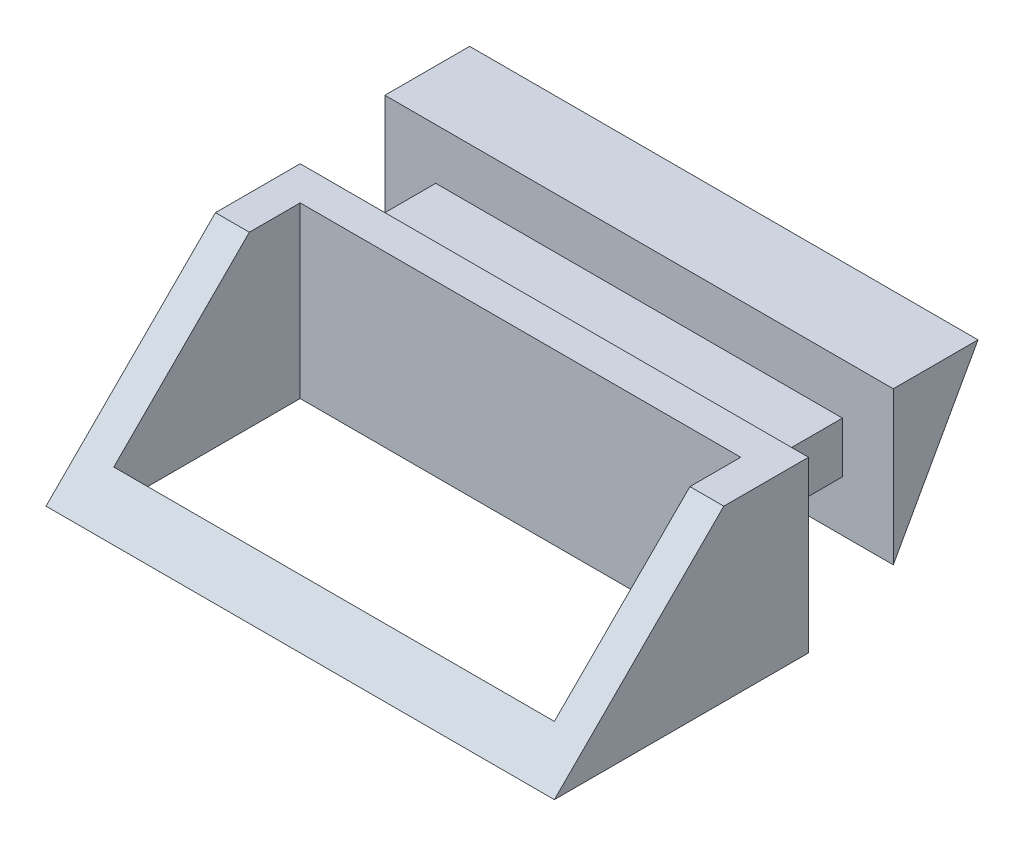
ISO-10303-21;
HEADER;
FILE_DESCRIPTION(('STEP AP214'),'2;1');
FILE_NAME('part.step','',(''),(''),'','','');
FILE_SCHEMA(('AUTOMOTIVE_DESIGN { 1 0 10303 214 1 1 1 1 }'));
ENDSEC;
DATA;
#1=APPLICATION_CONTEXT('core data for automotive mechanical design processes');
#2=APPLICATION_PROTOCOL_DEFINITION('international standard','automotive_design',2000,#1);
#3=PRODUCT_CONTEXT('',#1,'mechanical');
#4=PRODUCT('Part','Part','',(#3));
#5=PRODUCT_RELATED_PRODUCT_CATEGORY('part','',(#4));
#6=PRODUCT_DEFINITION_FORMATION('','',#4);
#7=PRODUCT_DEFINITION_CONTEXT('part definition',#1,'design');
#8=PRODUCT_DEFINITION('design','',#6,#7);
#9=PRODUCT_DEFINITION_SHAPE('','',#8);
#10=(LENGTH_UNIT() NAMED_UNIT(*) SI_UNIT(.MILLI.,.METRE.));
#11=(NAMED_UNIT(*) PLANE_ANGLE_UNIT() SI_UNIT($,.RADIAN.));
#12=(NAMED_UNIT(*) SI_UNIT($,.STERADIAN.) SOLID_ANGLE_UNIT());
#13=UNCERTAINTY_MEASURE_WITH_UNIT(LENGTH_MEASURE(1.E-05),#10,'distance_accuracy_value','');
#14=(GEOMETRIC_REPRESENTATION_CONTEXT(3) GLOBAL_UNCERTAINTY_ASSIGNED_CONTEXT((#13)) GLOBAL_UNIT_ASSIGNED_CONTEXT((#10,
#11,#12)) REPRESENTATION_CONTEXT('',''));
#15=CARTESIAN_POINT('',(0.,0.,0.));
#16=DIRECTION('',(0.,0.,1.));
#17=DIRECTION('',(1.,0.,0.));
#18=AXIS2_PLACEMENT_3D('',#15,#16,#17);
#19=CARTESIAN_POINT('',(-15.,10.,-7.5));
#20=DIRECTION('',(0.,0.,1.));
#21=DIRECTION('',(1.,0.,0.));
#22=AXIS2_PLACEMENT_3D('',#19,#20,#21);
#23=PLANE('',#22);
#24=DIRECTION('',(-1.,0.,0.));
#25=VECTOR('',#24,1.);
#26=CARTESIAN_POINT('',(-15.,0.,-7.5));
#27=LINE('',#26,#25);
#28=CARTESIAN_POINT('',(15.,0.,-7.5));
#29=VERTEX_POINT('',#28);
#30=CARTESIAN_POINT('',(-15.,0.,-7.5));
#31=VERTEX_POINT('',#30);
#32=EDGE_CURVE('E288',#29,#31,#27,.T.);
#33=ORIENTED_EDGE('',*,*,#32,.T.);
#34=DIRECTION('',(0.,-1.,0.));
#35=VECTOR('',#34,1.);
#36=CARTESIAN_POINT('',(-15.,10.,-7.5));
#37=LINE('',#36,#35);
#38=CARTESIAN_POINT('',(-15.,10.,-7.5));
#39=VERTEX_POINT('',#38);
#40=EDGE_CURVE('E284',#39,#31,#37,.T.);
#41=ORIENTED_EDGE('',*,*,#40,.F.);
#42=DIRECTION('',(-1.,0.,0.));
#43=VECTOR('',#42,1.);
#44=CARTESIAN_POINT('',(-15.,10.,-7.5));
#45=LINE('',#44,#43);
#46=CARTESIAN_POINT('',(15.,10.,-7.5));
#47=VERTEX_POINT('',#46);
#48=EDGE_CURVE('E276',#47,#39,#45,.T.);
#49=ORIENTED_EDGE('',*,*,#48,.F.);
#50=DIRECTION('',(0.,-1.,0.));
#51=VECTOR('',#50,1.);
#52=CARTESIAN_POINT('',(15.,10.,-7.5));
#53=LINE('',#52,#51);
#54=EDGE_CURVE('E300',#47,#29,#53,.T.);
#55=ORIENTED_EDGE('',*,*,#54,.T.);
#56=EDGE_LOOP('',(#33,#41,#49,#55));
#57=FACE_BOUND('',#56,.T.);
#58=DIRECTION('',(0.,-1.,0.));
#59=VECTOR('',#58,1.);
#60=CARTESIAN_POINT('',(12.,5.,-7.5));
#61=LINE('',#60,#59);
#62=CARTESIAN_POINT('',(12.,8.,-7.5));
#63=VERTEX_POINT('',#62);
#64=CARTESIAN_POINT('',(12.,5.,-7.5));
#65=VERTEX_POINT('',#64);
#66=EDGE_CURVE('E224',#63,#65,#61,.T.);
#67=ORIENTED_EDGE('',*,*,#66,.F.);
#68=DIRECTION('',(1.,0.,0.));
#69=VECTOR('',#68,1.);
#70=CARTESIAN_POINT('',(12.,8.,-7.5));
#71=LINE('',#70,#69);
#72=CARTESIAN_POINT('',(-12.,8.,-7.5));
#73=VERTEX_POINT('',#72);
#74=EDGE_CURVE('E230',#73,#63,#71,.T.);
#75=ORIENTED_EDGE('',*,*,#74,.F.);
#76=DIRECTION('',(0.,1.,0.));
#77=VECTOR('',#76,1.);
#78=CARTESIAN_POINT('',(-12.,5.,-7.5));
#79=LINE('',#78,#77);
#80=CARTESIAN_POINT('',(-12.,5.,-7.5));
#81=VERTEX_POINT('',#80);
#82=EDGE_CURVE('E250',#81,#73,#79,.T.);
#83=ORIENTED_EDGE('',*,*,#82,.F.);
#84=DIRECTION('',(-1.,0.,0.));
#85=VECTOR('',#84,1.);
#86=CARTESIAN_POINT('',(12.,5.,-7.5));
#87=LINE('',#86,#85);
#88=EDGE_CURVE('E246',#65,#81,#87,.T.);
#89=ORIENTED_EDGE('',*,*,#88,.F.);
#90=EDGE_LOOP('',(#67,#75,#83,#89));
#91=FACE_BOUND('',#90,.T.);
#92=ADVANCED_FACE('F40',(#57,#91),#23,.F.);
#93=CARTESIAN_POINT('',(15.,10.,7.5));
#94=DIRECTION('',(-1.,0.,0.));
#95=DIRECTION('',(0.,0.,1.));
#96=AXIS2_PLACEMENT_3D('',#93,#94,#95);
#97=PLANE('',#96);
#98=DIRECTION('',(0.,0.,-1.));
#99=VECTOR('',#98,1.);
#100=CARTESIAN_POINT('',(15.,10.,7.5));
#101=LINE('',#100,#99);
#102=CARTESIAN_POINT('',(15.,10.,-2.50000000000001));
#103=VERTEX_POINT('',#102);
#104=EDGE_CURVE('E273',#103,#47,#101,.T.);
#105=ORIENTED_EDGE('',*,*,#104,.F.);
#106=DIRECTION('',(0.,0.707106781186549,-0.707106781186546));
#107=VECTOR('',#106,1.);
#108=CARTESIAN_POINT('',(15.,10.,-2.50000000000001));
#109=LINE('',#108,#107);
#110=CARTESIAN_POINT('',(15.,0.,7.5));
#111=VERTEX_POINT('',#110);
#112=EDGE_CURVE('E309',#103,#111,#109,.F.);
#113=ORIENTED_EDGE('',*,*,#112,.T.);
#114=DIRECTION('',(0.,0.,-1.));
#115=VECTOR('',#114,1.);
#116=CARTESIAN_POINT('',(15.,0.,7.5));
#117=LINE('',#116,#115);
#118=EDGE_CURVE('E272',#111,#29,#117,.T.);
#119=ORIENTED_EDGE('',*,*,#118,.T.);
#120=ORIENTED_EDGE('',*,*,#54,.F.);
#121=EDGE_LOOP('',(#105,#113,#119,#120));
#122=FACE_BOUND('',#121,.T.);
#123=ADVANCED_FACE('F351',(#122),#97,.F.);
#124=CARTESIAN_POINT('',(-15.,10.,7.5));
#125=DIRECTION('',(1.,0.,0.));
#126=DIRECTION('',(0.,0.,-1.));
#127=AXIS2_PLACEMENT_3D('',#124,#125,#126);
#128=PLANE('',#127);
#129=DIRECTION('',(0.,0.,1.));
#130=VECTOR('',#129,1.);
#131=CARTESIAN_POINT('',(-15.,0.,7.5));
#132=LINE('',#131,#130);
#133=CARTESIAN_POINT('',(-15.,0.,7.5));
#134=VERTEX_POINT('',#133);
#135=EDGE_CURVE('E291',#31,#134,#132,.T.);
#136=ORIENTED_EDGE('',*,*,#135,.T.);
#137=DIRECTION('',(0.,-0.707106781186549,0.707106781186546));
#138=VECTOR('',#137,1.);
#139=CARTESIAN_POINT('',(-15.,10.,-2.50000000000001));
#140=LINE('',#139,#138);
#141=CARTESIAN_POINT('',(-15.,10.,-2.50000000000001));
#142=VERTEX_POINT('',#141);
#143=EDGE_CURVE('E312',#134,#142,#140,.F.);
#144=ORIENTED_EDGE('',*,*,#143,.T.);
#145=DIRECTION('',(0.,0.,1.));
#146=VECTOR('',#145,1.);
#147=CARTESIAN_POINT('',(-15.,10.,7.5));
#148=LINE('',#147,#146);
#149=EDGE_CURVE('E280',#39,#142,#148,.T.);
#150=ORIENTED_EDGE('',*,*,#149,.F.);
#151=ORIENTED_EDGE('',*,*,#40,.T.);
#152=EDGE_LOOP('',(#136,#144,#150,#151));
#153=FACE_BOUND('',#152,.T.);
#154=ADVANCED_FACE('F357',(#153),#128,.F.);
#155=CARTESIAN_POINT('',(0.,10.,0.));
#156=DIRECTION('',(0.,-1.,0.));
#157=DIRECTION('',(0.,0.,-1.));
#158=AXIS2_PLACEMENT_3D('',#155,#156,#157);
#159=PLANE('',#158);
#160=DIRECTION('',(1.,0.,0.));
#161=VECTOR('',#160,1.);
#162=CARTESIAN_POINT('',(0.,10.,-2.50000000000001));
#163=LINE('',#162,#161);
#164=CARTESIAN_POINT('',(-13.,10.,-2.50000000000001));
#165=VERTEX_POINT('',#164);
#166=EDGE_CURVE('E305',#142,#165,#163,.T.);
#167=ORIENTED_EDGE('',*,*,#166,.T.);
#168=DIRECTION('',(0.,0.,-1.));
#169=VECTOR('',#168,1.);
#170=CARTESIAN_POINT('',(-13.,10.,0.));
#171=LINE('',#170,#169);
#172=CARTESIAN_POINT('',(-13.,10.,-5.5));
#173=VERTEX_POINT('',#172);
#174=EDGE_CURVE('E179',#165,#173,#171,.T.);
#175=ORIENTED_EDGE('',*,*,#174,.T.);
#176=DIRECTION('',(1.,0.,0.));
#177=VECTOR('',#176,1.);
#178=CARTESIAN_POINT('',(0.,10.,-5.5));
#179=LINE('',#178,#177);
#180=CARTESIAN_POINT('',(13.,10.,-5.5));
#181=VERTEX_POINT('',#180);
#182=EDGE_CURVE('E188',#173,#181,#179,.T.);
#183=ORIENTED_EDGE('',*,*,#182,.T.);
#184=DIRECTION('',(0.,0.,1.));
#185=VECTOR('',#184,1.);
#186=CARTESIAN_POINT('',(13.,10.,0.));
#187=LINE('',#186,#185);
#188=CARTESIAN_POINT('',(13.,10.,-2.50000000000001));
#189=VERTEX_POINT('',#188);
#190=EDGE_CURVE('E162',#181,#189,#187,.T.);
#191=ORIENTED_EDGE('',*,*,#190,.T.);
#192=EDGE_CURVE('E304',#189,#103,#163,.T.);
#193=ORIENTED_EDGE('',*,*,#192,.T.);
#194=ORIENTED_EDGE('',*,*,#104,.T.);
#195=ORIENTED_EDGE('',*,*,#48,.T.);
#196=ORIENTED_EDGE('',*,*,#149,.T.);
#197=EDGE_LOOP('',(#167,#175,#183,#191,#193,#194,#195,#196));
#198=FACE_BOUND('',#197,.T.);
#199=ADVANCED_FACE('F331',(#198),#159,.F.);
#200=CARTESIAN_POINT('',(0.,0.,0.));
#201=DIRECTION('',(0.,-1.,0.));
#202=DIRECTION('',(0.,0.,-1.));
#203=AXIS2_PLACEMENT_3D('',#200,#201,#202);
#204=PLANE('',#203);
#205=DIRECTION('',(0.,0.,-1.));
#206=VECTOR('',#205,1.);
#207=CARTESIAN_POINT('',(-13.,0.,0.));
#208=LINE('',#207,#206);
#209=CARTESIAN_POINT('',(-13.,0.,5.5));
#210=VERTEX_POINT('',#209);
#211=CARTESIAN_POINT('',(-13.,0.,-5.5));
#212=VERTEX_POINT('',#211);
#213=EDGE_CURVE('E177',#210,#212,#208,.T.);
#214=ORIENTED_EDGE('',*,*,#213,.F.);
#215=DIRECTION('',(-1.,0.,0.));
#216=VECTOR('',#215,1.);
#217=CARTESIAN_POINT('',(0.,0.,5.5));
#218=LINE('',#217,#216);
#219=CARTESIAN_POINT('',(13.,0.,5.5));
#220=VERTEX_POINT('',#219);
#221=EDGE_CURVE('E161',#220,#210,#218,.T.);
#222=ORIENTED_EDGE('',*,*,#221,.F.);
#223=DIRECTION('',(0.,0.,1.));
#224=VECTOR('',#223,1.);
#225=CARTESIAN_POINT('',(13.,0.,0.));
#226=LINE('',#225,#224);
#227=CARTESIAN_POINT('',(13.,0.,-5.5));
#228=VERTEX_POINT('',#227);
#229=EDGE_CURVE('E153',#228,#220,#226,.T.);
#230=ORIENTED_EDGE('',*,*,#229,.F.);
#231=DIRECTION('',(1.,0.,0.));
#232=VECTOR('',#231,1.);
#233=CARTESIAN_POINT('',(0.,0.,-5.5));
#234=LINE('',#233,#232);
#235=EDGE_CURVE('E11',#212,#228,#234,.T.);
#236=ORIENTED_EDGE('',*,*,#235,.F.);
#237=EDGE_LOOP('',(#214,#222,#230,#236));
#238=FACE_BOUND('',#237,.T.);
#239=ORIENTED_EDGE('',*,*,#118,.F.);
#240=DIRECTION('',(1.,0.,0.));
#241=VECTOR('',#240,1.);
#242=CARTESIAN_POINT('',(-15.,0.,7.5));
#243=LINE('',#242,#241);
#244=EDGE_CURVE('E277',#134,#111,#243,.T.);
#245=ORIENTED_EDGE('',*,*,#244,.F.);
#246=ORIENTED_EDGE('',*,*,#135,.F.);
#247=ORIENTED_EDGE('',*,*,#32,.F.);
#248=EDGE_LOOP('',(#239,#245,#246,#247));
#249=FACE_BOUND('',#248,.T.);
#250=ADVANCED_FACE('F175',(#238,#249),#204,.T.);
#251=CARTESIAN_POINT('',(0.,10.,-2.50000000000001));
#252=DIRECTION('',(0.,-0.707106781186546,-0.707106781186549));
#253=DIRECTION('',(1.,0.,0.));
#254=AXIS2_PLACEMENT_3D('',#251,#252,#253);
#255=PLANE('',#254);
#256=DIRECTION('',(0.,0.707106781186549,-0.707106781186546));
#257=VECTOR('',#256,1.);
#258=CARTESIAN_POINT('',(-13.,10.,-2.50000000000001));
#259=LINE('',#258,#257);
#260=CARTESIAN_POINT('',(-13.,1.99999999999997,5.5));
#261=VERTEX_POINT('',#260);
#262=EDGE_CURVE('E50',#165,#261,#259,.F.);
#263=ORIENTED_EDGE('',*,*,#262,.F.);
#264=ORIENTED_EDGE('',*,*,#166,.F.);
#265=ORIENTED_EDGE('',*,*,#143,.F.);
#266=ORIENTED_EDGE('',*,*,#244,.T.);
#267=ORIENTED_EDGE('',*,*,#112,.F.);
#268=ORIENTED_EDGE('',*,*,#192,.F.);
#269=DIRECTION('',(0.,-0.707106781186549,0.707106781186546));
#270=VECTOR('',#269,1.);
#271=CARTESIAN_POINT('',(13.,10.,-2.50000000000001));
#272=LINE('',#271,#270);
#273=CARTESIAN_POINT('',(13.,1.99999999999997,5.5));
#274=VERTEX_POINT('',#273);
#275=EDGE_CURVE('E315',#274,#189,#272,.F.);
#276=ORIENTED_EDGE('',*,*,#275,.F.);
#277=DIRECTION('',(-1.,0.,0.));
#278=VECTOR('',#277,1.);
#279=CARTESIAN_POINT('',(0.,1.99999999999997,5.5));
#280=LINE('',#279,#278);
#281=EDGE_CURVE('E169',#261,#274,#280,.F.);
#282=ORIENTED_EDGE('',*,*,#281,.F.);
#283=EDGE_LOOP('',(#263,#264,#265,#266,#267,#268,#276,#282));
#284=FACE_BOUND('',#283,.T.);
#285=ADVANCED_FACE('F43',(#284),#255,.F.);
#286=CARTESIAN_POINT('',(12.,5.,-12.5));
#287=DIRECTION('',(-1.,0.,0.));
#288=DIRECTION('',(0.,0.,1.));
#289=AXIS2_PLACEMENT_3D('',#286,#287,#288);
#290=PLANE('',#289);
#291=ORIENTED_EDGE('',*,*,#66,.T.);
#292=DIRECTION('',(0.,0.,1.));
#293=VECTOR('',#292,1.);
#294=CARTESIAN_POINT('',(12.,5.,-12.5));
#295=LINE('',#294,#293);
#296=CARTESIAN_POINT('',(12.,5.,-12.5));
#297=VERTEX_POINT('',#296);
#298=EDGE_CURVE('E268',#297,#65,#295,.T.);
#299=ORIENTED_EDGE('',*,*,#298,.F.);
#300=DIRECTION('',(0.,-1.,0.));
#301=VECTOR('',#300,1.);
#302=CARTESIAN_POINT('',(12.,5.,-12.5));
#303=LINE('',#302,#301);
#304=CARTESIAN_POINT('',(12.,8.,-12.5));
#305=VERTEX_POINT('',#304);
#306=EDGE_CURVE('E225',#305,#297,#303,.T.);
#307=ORIENTED_EDGE('',*,*,#306,.F.);
#308=DIRECTION('',(0.,0.,1.));
#309=VECTOR('',#308,1.);
#310=CARTESIAN_POINT('',(12.,8.,-12.5));
#311=LINE('',#310,#309);
#312=EDGE_CURVE('E242',#305,#63,#311,.T.);
#313=ORIENTED_EDGE('',*,*,#312,.T.);
#314=EDGE_LOOP('',(#291,#299,#307,#313));
#315=FACE_BOUND('',#314,.T.);
#316=ADVANCED_FACE('F368',(#315),#290,.F.);
#317=CARTESIAN_POINT('',(12.,5.,-12.5));
#318=DIRECTION('',(0.,1.,0.));
#319=DIRECTION('',(0.,0.,1.));
#320=AXIS2_PLACEMENT_3D('',#317,#318,#319);
#321=PLANE('',#320);
#322=ORIENTED_EDGE('',*,*,#88,.T.);
#323=DIRECTION('',(0.,0.,1.));
#324=VECTOR('',#323,1.);
#325=CARTESIAN_POINT('',(-12.,5.,-12.5));
#326=LINE('',#325,#324);
#327=CARTESIAN_POINT('',(-12.,5.,-12.5));
#328=VERTEX_POINT('',#327);
#329=EDGE_CURVE('E264',#328,#81,#326,.T.);
#330=ORIENTED_EDGE('',*,*,#329,.F.);
#331=DIRECTION('',(-1.,0.,0.));
#332=VECTOR('',#331,1.);
#333=CARTESIAN_POINT('',(12.,5.,-12.5));
#334=LINE('',#333,#332);
#335=EDGE_CURVE('E229',#297,#328,#334,.T.);
#336=ORIENTED_EDGE('',*,*,#335,.F.);
#337=ORIENTED_EDGE('',*,*,#298,.T.);
#338=EDGE_LOOP('',(#322,#330,#336,#337));
#339=FACE_BOUND('',#338,.T.);
#340=ADVANCED_FACE('F371',(#339),#321,.F.);
#341=CARTESIAN_POINT('',(-12.,5.,-12.5));
#342=DIRECTION('',(1.,0.,0.));
#343=DIRECTION('',(0.,0.,-1.));
#344=AXIS2_PLACEMENT_3D('',#341,#342,#343);
#345=PLANE('',#344);
#346=ORIENTED_EDGE('',*,*,#82,.T.);
#347=DIRECTION('',(0.,0.,1.));
#348=VECTOR('',#347,1.);
#349=CARTESIAN_POINT('',(-12.,8.,-12.5));
#350=LINE('',#349,#348);
#351=CARTESIAN_POINT('',(-12.,8.,-12.5));
#352=VERTEX_POINT('',#351);
#353=EDGE_CURVE('E260',#352,#73,#350,.T.);
#354=ORIENTED_EDGE('',*,*,#353,.F.);
#355=DIRECTION('',(0.,1.,0.));
#356=VECTOR('',#355,1.);
#357=CARTESIAN_POINT('',(-12.,5.,-12.5));
#358=LINE('',#357,#356);
#359=EDGE_CURVE('E234',#328,#352,#358,.T.);
#360=ORIENTED_EDGE('',*,*,#359,.F.);
#361=ORIENTED_EDGE('',*,*,#329,.T.);
#362=EDGE_LOOP('',(#346,#354,#360,#361));
#363=FACE_BOUND('',#362,.T.);
#364=ADVANCED_FACE('F375',(#363),#345,.F.);
#365=CARTESIAN_POINT('',(12.,8.,-12.5));
#366=DIRECTION('',(0.,-1.,0.));
#367=DIRECTION('',(0.,0.,-1.));
#368=AXIS2_PLACEMENT_3D('',#365,#366,#367);
#369=PLANE('',#368);
#370=ORIENTED_EDGE('',*,*,#74,.T.);
#371=ORIENTED_EDGE('',*,*,#312,.F.);
#372=DIRECTION('',(1.,0.,0.));
#373=VECTOR('',#372,1.);
#374=CARTESIAN_POINT('',(12.,8.,-12.5));
#375=LINE('',#374,#373);
#376=EDGE_CURVE('E238',#352,#305,#375,.T.);
#377=ORIENTED_EDGE('',*,*,#376,.F.);
#378=ORIENTED_EDGE('',*,*,#353,.T.);
#379=EDGE_LOOP('',(#370,#371,#377,#378));
#380=FACE_BOUND('',#379,.T.);
#381=ADVANCED_FACE('F379',(#380),#369,.F.);
#382=CARTESIAN_POINT('',(15.,2.,-17.5));
#383=DIRECTION('',(-1.,0.,0.));
#384=DIRECTION('',(0.,0.,1.));
#385=AXIS2_PLACEMENT_3D('',#382,#383,#384);
#386=PLANE('',#385);
#387=DIRECTION('',(0.,-1.,0.));
#388=VECTOR('',#387,1.);
#389=CARTESIAN_POINT('',(15.,2.,-12.5));
#390=LINE('',#389,#388);
#391=CARTESIAN_POINT('',(15.,11.,-12.5));
#392=VERTEX_POINT('',#391);
#393=CARTESIAN_POINT('',(15.,2.,-12.5));
#394=VERTEX_POINT('',#393);
#395=EDGE_CURVE('E200',#392,#394,#390,.T.);
#396=ORIENTED_EDGE('',*,*,#395,.T.);
#397=DIRECTION('',(0.,0.874157276121538,-0.485642931178632));
#398=VECTOR('',#397,1.);
#399=CARTESIAN_POINT('',(15.,2.,-12.5));
#400=LINE('',#399,#398);
#401=CARTESIAN_POINT('',(15.,11.,-17.5));
#402=VERTEX_POINT('',#401);
#403=EDGE_CURVE('E192',#394,#402,#400,.T.);
#404=ORIENTED_EDGE('',*,*,#403,.T.);
#405=DIRECTION('',(0.,0.,1.));
#406=VECTOR('',#405,1.);
#407=CARTESIAN_POINT('',(15.,11.,-17.5));
#408=LINE('',#407,#406);
#409=EDGE_CURVE('E204',#402,#392,#408,.T.);
#410=ORIENTED_EDGE('',*,*,#409,.T.);
#411=EDGE_LOOP('',(#396,#404,#410));
#412=FACE_BOUND('',#411,.T.);
#413=ADVANCED_FACE('F383',(#412),#386,.F.);
#414=CARTESIAN_POINT('',(-15.,2.,-17.5));
#415=DIRECTION('',(1.,0.,0.));
#416=DIRECTION('',(0.,0.,-1.));
#417=AXIS2_PLACEMENT_3D('',#414,#415,#416);
#418=PLANE('',#417);
#419=DIRECTION('',(0.,0.,1.));
#420=VECTOR('',#419,1.);
#421=CARTESIAN_POINT('',(-15.,11.,-17.5));
#422=LINE('',#421,#420);
#423=CARTESIAN_POINT('',(-15.,11.,-17.5));
#424=VERTEX_POINT('',#423);
#425=CARTESIAN_POINT('',(-15.,11.,-12.5));
#426=VERTEX_POINT('',#425);
#427=EDGE_CURVE('E220',#424,#426,#422,.T.);
#428=ORIENTED_EDGE('',*,*,#427,.F.);
#429=DIRECTION('',(0.,-0.874157276121538,0.485642931178632));
#430=VECTOR('',#429,1.);
#431=CARTESIAN_POINT('',(-15.,4.12264150943396,-13.6792452830189));
#432=LINE('',#431,#430);
#433=CARTESIAN_POINT('',(-15.,2.,-12.5));
#434=VERTEX_POINT('',#433);
#435=EDGE_CURVE('E196',#424,#434,#432,.T.);
#436=ORIENTED_EDGE('',*,*,#435,.T.);
#437=DIRECTION('',(0.,1.,0.));
#438=VECTOR('',#437,1.);
#439=CARTESIAN_POINT('',(-15.,2.,-12.5));
#440=LINE('',#439,#438);
#441=EDGE_CURVE('E212',#434,#426,#440,.T.);
#442=ORIENTED_EDGE('',*,*,#441,.T.);
#443=EDGE_LOOP('',(#428,#436,#442));
#444=FACE_BOUND('',#443,.T.);
#445=ADVANCED_FACE('F387',(#444),#418,.F.);
#446=CARTESIAN_POINT('',(15.,11.,-17.5));
#447=DIRECTION('',(0.,-1.,0.));
#448=DIRECTION('',(0.,0.,-1.));
#449=AXIS2_PLACEMENT_3D('',#446,#447,#448);
#450=PLANE('',#449);
#451=DIRECTION('',(1.,0.,0.));
#452=VECTOR('',#451,1.);
#453=CARTESIAN_POINT('',(15.,11.,-12.5));
#454=LINE('',#453,#452);
#455=EDGE_CURVE('E205',#426,#392,#454,.T.);
#456=ORIENTED_EDGE('',*,*,#455,.T.);
#457=ORIENTED_EDGE('',*,*,#409,.F.);
#458=DIRECTION('',(1.,0.,0.));
#459=VECTOR('',#458,1.);
#460=CARTESIAN_POINT('',(15.,11.,-17.5));
#461=LINE('',#460,#459);
#462=EDGE_CURVE('E201',#424,#402,#461,.T.);
#463=ORIENTED_EDGE('',*,*,#462,.F.);
#464=ORIENTED_EDGE('',*,*,#427,.T.);
#465=EDGE_LOOP('',(#456,#457,#463,#464));
#466=FACE_BOUND('',#465,.T.);
#467=ADVANCED_FACE('F391',(#466),#450,.F.);
#468=CARTESIAN_POINT('',(0.,0.,-12.5));
#469=DIRECTION('',(0.,0.,1.));
#470=DIRECTION('',(1.,0.,0.));
#471=AXIS2_PLACEMENT_3D('',#468,#469,#470);
#472=PLANE('',#471);
#473=ORIENTED_EDGE('',*,*,#376,.T.);
#474=ORIENTED_EDGE('',*,*,#306,.T.);
#475=ORIENTED_EDGE('',*,*,#335,.T.);
#476=ORIENTED_EDGE('',*,*,#359,.T.);
#477=EDGE_LOOP('',(#473,#474,#475,#476));
#478=FACE_BOUND('',#477,.T.);
#479=ORIENTED_EDGE('',*,*,#395,.F.);
#480=ORIENTED_EDGE('',*,*,#455,.F.);
#481=ORIENTED_EDGE('',*,*,#441,.F.);
#482=DIRECTION('',(-1.,0.,0.));
#483=VECTOR('',#482,1.);
#484=CARTESIAN_POINT('',(15.,2.,-12.5));
#485=LINE('',#484,#483);
#486=EDGE_CURVE('E209',#394,#434,#485,.T.);
#487=ORIENTED_EDGE('',*,*,#486,.F.);
#488=EDGE_LOOP('',(#479,#480,#481,#487));
#489=FACE_BOUND('',#488,.T.);
#490=ADVANCED_FACE('F346',(#478,#489),#472,.T.);
#491=CARTESIAN_POINT('',(15.,2.,-12.5));
#492=DIRECTION('',(0.,0.485642931178632,0.874157276121538));
#493=DIRECTION('',(0.,-0.874157276121538,0.485642931178632));
#494=AXIS2_PLACEMENT_3D('',#491,#492,#493);
#495=PLANE('',#494);
#496=ORIENTED_EDGE('',*,*,#462,.T.);
#497=ORIENTED_EDGE('',*,*,#403,.F.);
#498=ORIENTED_EDGE('',*,*,#486,.T.);
#499=ORIENTED_EDGE('',*,*,#435,.F.);
#500=EDGE_LOOP('',(#496,#497,#498,#499));
#501=FACE_BOUND('',#500,.T.);
#502=ADVANCED_FACE('F339',(#501),#495,.F.);
#503=CARTESIAN_POINT('',(-13.,11.,-5.5));
#504=DIRECTION('',(0.,0.,-1.));
#505=DIRECTION('',(-1.,0.,0.));
#506=AXIS2_PLACEMENT_3D('',#503,#504,#505);
#507=PLANE('',#506);
#508=DIRECTION('',(0.,-1.,0.));
#509=VECTOR('',#508,1.);
#510=CARTESIAN_POINT('',(-13.,11.,-5.5));
#511=LINE('',#510,#509);
#512=EDGE_CURVE('E56',#173,#212,#511,.T.);
#513=ORIENTED_EDGE('',*,*,#512,.T.);
#514=ORIENTED_EDGE('',*,*,#235,.T.);
#515=DIRECTION('',(0.,-1.,0.));
#516=VECTOR('',#515,1.);
#517=CARTESIAN_POINT('',(13.,11.,-5.5));
#518=LINE('',#517,#516);
#519=EDGE_CURVE('E156',#181,#228,#518,.T.);
#520=ORIENTED_EDGE('',*,*,#519,.F.);
#521=ORIENTED_EDGE('',*,*,#182,.F.);
#522=EDGE_LOOP('',(#513,#514,#520,#521));
#523=FACE_BOUND('',#522,.T.);
#524=ADVANCED_FACE('F337',(#523),#507,.F.);
#525=CARTESIAN_POINT('',(-13.,11.,-5.5));
#526=DIRECTION('',(-1.,0.,0.));
#527=DIRECTION('',(0.,0.,1.));
#528=AXIS2_PLACEMENT_3D('',#525,#526,#527);
#529=PLANE('',#528);
#530=ORIENTED_EDGE('',*,*,#213,.T.);
#531=ORIENTED_EDGE('',*,*,#512,.F.);
#532=ORIENTED_EDGE('',*,*,#174,.F.);
#533=ORIENTED_EDGE('',*,*,#262,.T.);
#534=DIRECTION('',(0.,-1.,0.));
#535=VECTOR('',#534,1.);
#536=CARTESIAN_POINT('',(-13.,11.,5.5));
#537=LINE('',#536,#535);
#538=EDGE_CURVE('E172',#261,#210,#537,.T.);
#539=ORIENTED_EDGE('',*,*,#538,.T.);
#540=EDGE_LOOP('',(#530,#531,#532,#533,#539));
#541=FACE_BOUND('',#540,.T.);
#542=ADVANCED_FACE('F322',(#541),#529,.F.);
#543=CARTESIAN_POINT('',(13.,11.,-5.5));
#544=DIRECTION('',(1.,0.,0.));
#545=DIRECTION('',(0.,0.,-1.));
#546=AXIS2_PLACEMENT_3D('',#543,#544,#545);
#547=PLANE('',#546);
#548=ORIENTED_EDGE('',*,*,#229,.T.);
#549=DIRECTION('',(0.,-1.,0.));
#550=VECTOR('',#549,1.);
#551=CARTESIAN_POINT('',(13.,11.,5.5));
#552=LINE('',#551,#550);
#553=EDGE_CURVE('E64',#274,#220,#552,.T.);
#554=ORIENTED_EDGE('',*,*,#553,.F.);
#555=ORIENTED_EDGE('',*,*,#275,.T.);
#556=ORIENTED_EDGE('',*,*,#190,.F.);
#557=ORIENTED_EDGE('',*,*,#519,.T.);
#558=EDGE_LOOP('',(#548,#554,#555,#556,#557));
#559=FACE_BOUND('',#558,.T.);
#560=ADVANCED_FACE('F154',(#559),#547,.F.);
#561=CARTESIAN_POINT('',(-13.,11.,5.5));
#562=DIRECTION('',(0.,0.,1.));
#563=DIRECTION('',(1.,0.,0.));
#564=AXIS2_PLACEMENT_3D('',#561,#562,#563);
#565=PLANE('',#564);
#566=ORIENTED_EDGE('',*,*,#221,.T.);
#567=ORIENTED_EDGE('',*,*,#538,.F.);
#568=ORIENTED_EDGE('',*,*,#281,.T.);
#569=ORIENTED_EDGE('',*,*,#553,.T.);
#570=EDGE_LOOP('',(#566,#567,#568,#569));
#571=FACE_BOUND('',#570,.T.);
#572=ADVANCED_FACE('F165',(#571),#565,.F.);
#573=CLOSED_SHELL('',(#92,#123,#154,#199,#250,#285,#316,#340,#364,#381,#413,#445,#467,#490,#502,
#524,#542,#560,#572));
#574=MANIFOLD_SOLID_BREP('B2',#573);
#575=ADVANCED_BREP_SHAPE_REPRESENTATION('',(#18,#574),#14);
#576=SHAPE_DEFINITION_REPRESENTATION(#9,#575);
ENDSEC;
END-ISO-10303-21;
